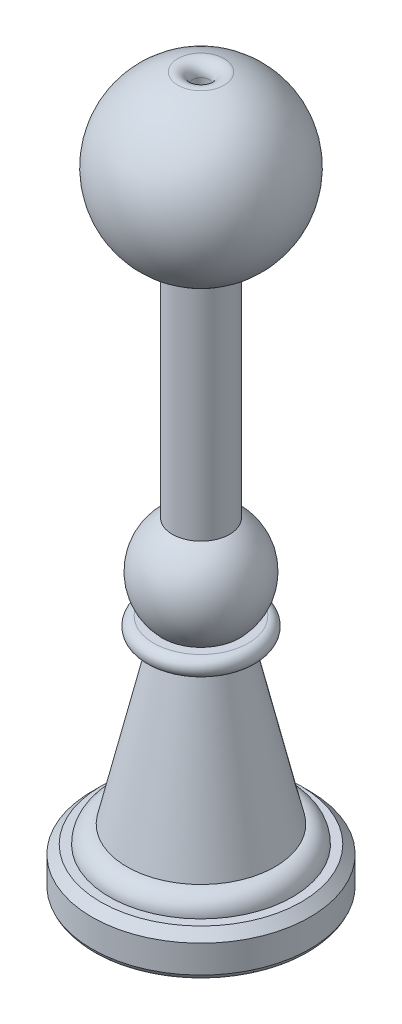
ISO-10303-21;
HEADER;
FILE_DESCRIPTION(('STEP AP214'),'2;1');
FILE_NAME('part.step','',(''),(''),'','','');
FILE_SCHEMA(('AUTOMOTIVE_DESIGN { 1 0 10303 214 1 1 1 1 }'));
ENDSEC;
DATA;
#1=APPLICATION_CONTEXT('core data for automotive mechanical design processes');
#2=APPLICATION_PROTOCOL_DEFINITION('international standard','automotive_design',2000,#1);
#3=PRODUCT_CONTEXT('',#1,'mechanical');
#4=PRODUCT('Part','Part','',(#3));
#5=PRODUCT_RELATED_PRODUCT_CATEGORY('part','',(#4));
#6=PRODUCT_DEFINITION_FORMATION('','',#4);
#7=PRODUCT_DEFINITION_CONTEXT('part definition',#1,'design');
#8=PRODUCT_DEFINITION('design','',#6,#7);
#9=PRODUCT_DEFINITION_SHAPE('','',#8);
#10=(LENGTH_UNIT() NAMED_UNIT(*) SI_UNIT(.MILLI.,.METRE.));
#11=(NAMED_UNIT(*) PLANE_ANGLE_UNIT() SI_UNIT($,.RADIAN.));
#12=(NAMED_UNIT(*) SI_UNIT($,.STERADIAN.) SOLID_ANGLE_UNIT());
#13=UNCERTAINTY_MEASURE_WITH_UNIT(LENGTH_MEASURE(1.E-05),#10,'distance_accuracy_value','');
#14=(GEOMETRIC_REPRESENTATION_CONTEXT(3) GLOBAL_UNCERTAINTY_ASSIGNED_CONTEXT((#13)) GLOBAL_UNIT_ASSIGNED_CONTEXT((#10,
#11,#12)) REPRESENTATION_CONTEXT('',''));
#15=CARTESIAN_POINT('',(0.,0.,0.));
#16=DIRECTION('',(0.,0.,1.));
#17=DIRECTION('',(1.,0.,0.));
#18=AXIS2_PLACEMENT_3D('',#15,#16,#17);
#19=CARTESIAN_POINT('',(0.,62.32,0.));
#20=DIRECTION('',(0.,-1.,0.));
#21=DIRECTION('',(1.,0.,0.));
#22=AXIS2_PLACEMENT_3D('',#19,#20,#21);
#23=CYLINDRICAL_SURFACE('',#22,0.75);
#24=CARTESIAN_POINT('',(0.,60.6510598246399,0.));
#25=DIRECTION('',(0.,-1.,0.));
#26=DIRECTION('',(1.,0.,0.));
#27=AXIS2_PLACEMENT_3D('',#24,#25,#26);
#28=CIRCLE('',#27,0.75);
#29=CARTESIAN_POINT('',(0.75,60.6510598246399,0.));
#30=VERTEX_POINT('',#29);
#31=EDGE_CURVE('E53',#30,#30,#28,.F.);
#32=ORIENTED_EDGE('',*,*,#31,.T.);
#33=EDGE_LOOP('',(#32));
#34=FACE_BOUND('',#33,.T.);
#35=CARTESIAN_POINT('',(0.,1.32,0.));
#36=DIRECTION('',(0.,-1.,0.));
#37=DIRECTION('',(1.,0.,0.));
#38=AXIS2_PLACEMENT_3D('',#35,#36,#37);
#39=CIRCLE('',#38,0.75);
#40=CARTESIAN_POINT('',(0.75,1.32,0.));
#41=VERTEX_POINT('',#40);
#42=EDGE_CURVE('E67',#41,#41,#39,.F.);
#43=ORIENTED_EDGE('',*,*,#42,.F.);
#44=EDGE_LOOP('',(#43));
#45=FACE_BOUND('',#44,.T.);
#46=ADVANCED_FACE('F45',(#34,#45),#23,.F.);
#47=CARTESIAN_POINT('',(0.,0.,0.));
#48=DIRECTION('',(0.,-1.,0.));
#49=DIRECTION('',(0.,0.,-1.));
#50=AXIS2_PLACEMENT_3D('',#47,#48,#49);
#51=CYLINDRICAL_SURFACE('',#50,9.525);
#52=CARTESIAN_POINT('',(0.,2.413,0.));
#53=DIRECTION('',(0.,-1.,0.));
#54=DIRECTION('',(0.,0.,-1.));
#55=AXIS2_PLACEMENT_3D('',#52,#53,#54);
#56=CIRCLE('',#55,9.525);
#57=CARTESIAN_POINT('',(0.,2.413,-9.525));
#58=VERTEX_POINT('',#57);
#59=EDGE_CURVE('E116',#58,#58,#56,.T.);
#60=ORIENTED_EDGE('',*,*,#59,.T.);
#61=EDGE_LOOP('',(#60));
#62=FACE_BOUND('',#61,.T.);
#63=CARTESIAN_POINT('',(0.,0.,0.));
#64=DIRECTION('',(0.,-1.,0.));
#65=DIRECTION('',(0.,0.,-1.));
#66=AXIS2_PLACEMENT_3D('',#63,#64,#65);
#67=CIRCLE('',#66,9.525);
#68=CARTESIAN_POINT('',(0.,0.,-9.525));
#69=VERTEX_POINT('',#68);
#70=EDGE_CURVE('E112',#69,#69,#67,.T.);
#71=ORIENTED_EDGE('',*,*,#70,.F.);
#72=EDGE_LOOP('',(#71));
#73=FACE_BOUND('',#72,.T.);
#74=ADVANCED_FACE('F148',(#62,#73),#51,.T.);
#75=CARTESIAN_POINT('',(-9.525,3.175,0.));
#76=DIRECTION('',(0.,-1.,0.));
#77=DIRECTION('',(0.,0.,-1.));
#78=AXIS2_PLACEMENT_3D('',#75,#76,#77);
#79=PLANE('',#78);
#80=CARTESIAN_POINT('',(0.,3.175,0.));
#81=DIRECTION('',(0.,-1.,0.));
#82=DIRECTION('',(0.,0.,-1.));
#83=AXIS2_PLACEMENT_3D('',#80,#81,#82);
#84=CIRCLE('',#83,8.763);
#85=CARTESIAN_POINT('',(0.,3.175,-8.763));
#86=VERTEX_POINT('',#85);
#87=EDGE_CURVE('E120',#86,#86,#84,.F.);
#88=ORIENTED_EDGE('',*,*,#87,.T.);
#89=EDGE_LOOP('',(#88));
#90=FACE_BOUND('',#89,.T.);
#91=CARTESIAN_POINT('',(0.,3.175,0.));
#92=DIRECTION('',(0.,-1.,0.));
#93=DIRECTION('',(0.,0.,-1.));
#94=AXIS2_PLACEMENT_3D('',#91,#92,#93);
#95=CIRCLE('',#94,8.001);
#96=CARTESIAN_POINT('',(0.,3.175,-8.001));
#97=VERTEX_POINT('',#96);
#98=EDGE_CURVE('E108',#97,#97,#95,.T.);
#99=ORIENTED_EDGE('',*,*,#98,.T.);
#100=EDGE_LOOP('',(#99));
#101=FACE_BOUND('',#100,.T.);
#102=ADVANCED_FACE('F155',(#90,#101),#79,.F.);
#103=CARTESIAN_POINT('',(0.,18.923,0.));
#104=DIRECTION('',(0.,-1.,0.));
#105=DIRECTION('',(0.,0.,-1.));
#106=AXIS2_PLACEMENT_3D('',#103,#104,#105);
#107=CONICAL_SURFACE('',#106,3.175,0.228102628279942);
#108=CARTESIAN_POINT('',(0.,4.699,0.));
#109=DIRECTION('',(0.,-1.,0.));
#110=DIRECTION('',(0.,0.,-1.));
#111=AXIS2_PLACEMENT_3D('',#108,#109,#110);
#112=CIRCLE('',#111,6.477);
#113=CARTESIAN_POINT('',(0.,4.699,-6.477));
#114=VERTEX_POINT('',#113);
#115=EDGE_CURVE('E104',#114,#114,#112,.T.);
#116=ORIENTED_EDGE('',*,*,#115,.F.);
#117=EDGE_LOOP('',(#116));
#118=FACE_BOUND('',#117,.T.);
#119=CARTESIAN_POINT('',(0.,18.923,0.));
#120=DIRECTION('',(0.,-1.,0.));
#121=DIRECTION('',(0.,0.,-1.));
#122=AXIS2_PLACEMENT_3D('',#119,#120,#121);
#123=CIRCLE('',#122,3.175);
#124=CARTESIAN_POINT('',(0.,18.923,-3.175));
#125=VERTEX_POINT('',#124);
#126=EDGE_CURVE('E100',#125,#125,#123,.T.);
#127=ORIENTED_EDGE('',*,*,#126,.T.);
#128=EDGE_LOOP('',(#127));
#129=FACE_BOUND('',#128,.T.);
#130=ADVANCED_FACE('F186',(#118,#129),#107,.T.);
#131=CARTESIAN_POINT('',(-3.175,18.923,0.));
#132=DIRECTION('',(0.,1.,0.));
#133=DIRECTION('',(0.,0.,1.));
#134=AXIS2_PLACEMENT_3D('',#131,#132,#133);
#135=PLANE('',#134);
#136=ORIENTED_EDGE('',*,*,#126,.F.);
#137=EDGE_LOOP('',(#136));
#138=FACE_BOUND('',#137,.T.);
#139=CARTESIAN_POINT('',(0.,18.923,0.));
#140=DIRECTION('',(0.,-1.,0.));
#141=DIRECTION('',(0.,0.,-1.));
#142=AXIS2_PLACEMENT_3D('',#139,#140,#141);
#143=CIRCLE('',#142,4.1316907870011);
#144=CARTESIAN_POINT('',(0.,18.923,-4.1316907870011));
#145=VERTEX_POINT('',#144);
#146=EDGE_CURVE('E96',#145,#145,#143,.T.);
#147=ORIENTED_EDGE('',*,*,#146,.T.);
#148=EDGE_LOOP('',(#147));
#149=FACE_BOUND('',#148,.T.);
#150=ADVANCED_FACE('F182',(#138,#149),#135,.F.);
#151=CARTESIAN_POINT('',(0.,19.685,0.));
#152=DIRECTION('',(0.,-1.,0.));
#153=DIRECTION('',(0.,0.,-1.));
#154=AXIS2_PLACEMENT_3D('',#151,#152,#153);
#155=TOROIDAL_SURFACE('',#154,4.1316907870011,0.762000000000001);
#156=ORIENTED_EDGE('',*,*,#146,.F.);
#157=EDGE_LOOP('',(#156));
#158=FACE_BOUND('',#157,.T.);
#159=CARTESIAN_POINT('',(0.,20.447,0.));
#160=DIRECTION('',(0.,-1.,0.));
#161=DIRECTION('',(0.,0.,-1.));
#162=AXIS2_PLACEMENT_3D('',#159,#160,#161);
#163=CIRCLE('',#162,4.1316907870011);
#164=CARTESIAN_POINT('',(0.,20.447,-4.1316907870011));
#165=VERTEX_POINT('',#164);
#166=EDGE_CURVE('E92',#165,#165,#163,.T.);
#167=ORIENTED_EDGE('',*,*,#166,.T.);
#168=EDGE_LOOP('',(#167));
#169=FACE_BOUND('',#168,.T.);
#170=ADVANCED_FACE('F178',(#158,#169),#155,.T.);
#171=CARTESIAN_POINT('',(-4.1316907870011,20.447,0.));
#172=DIRECTION('',(0.,-1.,0.));
#173=DIRECTION('',(0.,0.,-1.));
#174=AXIS2_PLACEMENT_3D('',#171,#172,#173);
#175=PLANE('',#174);
#176=ORIENTED_EDGE('',*,*,#166,.F.);
#177=EDGE_LOOP('',(#176));
#178=FACE_BOUND('',#177,.T.);
#179=CARTESIAN_POINT('',(0.,20.447,0.));
#180=DIRECTION('',(0.,-1.,0.));
#181=DIRECTION('',(0.,0.,-1.));
#182=AXIS2_PLACEMENT_3D('',#179,#180,#181);
#183=CIRCLE('',#182,3.36969078700109);
#184=CARTESIAN_POINT('',(3.36969078700108,20.447,0.));
#185=VERTEX_POINT('',#184);
#186=EDGE_CURVE('E88',#185,#185,#183,.T.);
#187=ORIENTED_EDGE('',*,*,#186,.T.);
#188=EDGE_LOOP('',(#187));
#189=FACE_BOUND('',#188,.T.);
#190=ADVANCED_FACE('F174',(#178,#189),#175,.F.);
#191=CARTESIAN_POINT('',(0.,23.8125,0.));
#192=DIRECTION('',(0.,-1.,0.));
#193=DIRECTION('',(1.,0.,0.));
#194=AXIS2_PLACEMENT_3D('',#191,#192,#193);
#195=SPHERICAL_SURFACE('',#194,4.7625);
#196=CARTESIAN_POINT('',(0.,27.8660671019486,0.));
#197=DIRECTION('',(0.,-1.,0.));
#198=DIRECTION('',(1.,0.,0.));
#199=AXIS2_PLACEMENT_3D('',#196,#197,#198);
#200=CIRCLE('',#199,2.49999999999999);
#201=CARTESIAN_POINT('',(2.49999999999998,27.8660671019486,0.));
#202=VERTEX_POINT('',#201);
#203=EDGE_CURVE('E87',#202,#202,#200,.T.);
#204=CARTESIAN_POINT('',(2.49999999999998,27.8660671019486,0.));
#205=CARTESIAN_POINT('',(2.57612991964176,27.8191180478428,0.));
#206=CARTESIAN_POINT('',(2.65093398236838,27.7700197474447,0.));
#207=CARTESIAN_POINT('',(2.79766021287122,27.6676908126363,0.));
#208=CARTESIAN_POINT('',(2.86958238064744,27.6144601782259,0.));
#209=CARTESIAN_POINT('',(3.0103146401294,27.5040327339652,0.));
#210=CARTESIAN_POINT('',(3.07912473183514,27.4468359241149,0.));
#211=CARTESIAN_POINT('',(3.21341498499322,27.3286583883182,0.));
#212=CARTESIAN_POINT('',(3.27889514644556,27.2676776623718,0.));
#213=CARTESIAN_POINT('',(3.40631759596305,27.1421256206083,0.));
#214=CARTESIAN_POINT('',(3.4682598840282,27.0775543047913,0.));
#215=CARTESIAN_POINT('',(3.58841004719139,26.9450260567064,0.));
#216=CARTESIAN_POINT('',(3.64661792228943,26.8770691244385,0.));
#217=CARTESIAN_POINT('',(3.7591145241288,26.7379852936839,0.));
#218=CARTESIAN_POINT('',(3.81340325087013,26.6668583951973,0.));
#219=CARTESIAN_POINT('',(3.91788927084033,26.5216603603875,0.));
#220=CARTESIAN_POINT('',(3.9680865640692,26.4475892240644,0.));
#221=CARTESIAN_POINT('',(4.06423041283041,26.2967377807879,0.));
#222=CARTESIAN_POINT('',(4.11017696836274,26.2199574738344,0.));
#223=CARTESIAN_POINT('',(4.19767352836957,26.0639313554837,0.));
#224=CARTESIAN_POINT('',(4.23922353284406,25.9846855440865,0.));
#225=CARTESIAN_POINT('',(4.31779512979227,25.8239799070811,0.));
#226=CARTESIAN_POINT('',(4.35481672226598,25.7425200814727,0.));
#227=CARTESIAN_POINT('',(4.42421400546305,25.577644932649,0.));
#228=CARTESIAN_POINT('',(4.45658969618641,25.4942296094335,0.));
#229=CARTESIAN_POINT('',(4.5165924301033,25.325708187838,0.));
#230=CARTESIAN_POINT('',(4.54421947329682,25.240602089458,0.));
#231=CARTESIAN_POINT('',(4.59463723643526,25.068969205737,0.));
#232=CARTESIAN_POINT('',(4.61742795638018,24.982442420396,0.));
#233=CARTESIAN_POINT('',(4.6581007456005,24.8082427595718,0.));
#234=CARTESIAN_POINT('',(4.6759828148759,24.7205698840886,0.));
#235=CARTESIAN_POINT('',(4.70678155317015,24.5443562769701,0.));
#236=CARTESIAN_POINT('',(4.719698222189,24.4558155453348,0.));
#237=CARTESIAN_POINT('',(4.74052516831405,24.2781472140843,0.));
#238=CARTESIAN_POINT('',(4.74843544542025,24.1890196144692,0.));
#239=CARTESIAN_POINT('',(4.75922450408394,24.0104603978843,0.));
#240=CARTESIAN_POINT('',(4.76210328564143,23.9210287809147,0.));
#241=CARTESIAN_POINT('',(4.76282021725905,23.7421453450597,0.));
#242=CARTESIAN_POINT('',(4.76065836731919,23.6526935261744,0.));
#243=CARTESIAN_POINT('',(4.75130089667482,23.4740535660384,0.));
#244=CARTESIAN_POINT('',(4.74410527597032,23.3848654247876,0.));
#245=CARTESIAN_POINT('',(4.72470309943581,23.2070358626789,0.));
#246=CARTESIAN_POINT('',(4.7124965436058,23.1183944418209,0.));
#247=CARTESIAN_POINT('',(4.6831112349036,22.9419396282077,0.));
#248=CARTESIAN_POINT('',(4.66593248203139,22.8541262354525,0.));
#249=CARTESIAN_POINT('',(4.62665729680629,22.679606157989,0.));
#250=CARTESIAN_POINT('',(4.60456086445339,22.5928994732807,0.));
#251=CARTESIAN_POINT('',(4.55552044440026,22.4208679795895,0.));
#252=CARTESIAN_POINT('',(4.52857645670002,22.3355431706066,0.));
#253=CARTESIAN_POINT('',(4.46992643371321,22.1665462108799,0.));
#254=CARTESIAN_POINT('',(4.43822039842665,22.082874060136,0.));
#255=CARTESIAN_POINT('',(4.37014690179311,21.9174479535569,0.));
#256=CARTESIAN_POINT('',(4.33377944044614,21.8356939977217,0.));
#257=CARTESIAN_POINT('',(4.25649850205683,21.674363734087,0.));
#258=CARTESIAN_POINT('',(4.21558502501448,21.5947874262876,0.));
#259=CARTESIAN_POINT('',(4.12934190907289,21.438064986282,0.));
#260=CARTESIAN_POINT('',(4.08401227017364,21.360918854076,0.));
#261=CARTESIAN_POINT('',(3.98908063775333,21.2093016354034,0.));
#262=CARTESIAN_POINT('',(3.93947864423227,21.1348305489368,0.));
#263=CARTESIAN_POINT('',(3.83615989784472,20.9887995977479,0.));
#264=CARTESIAN_POINT('',(3.78244314497822,20.9172397330254,0.));
#265=CARTESIAN_POINT('',(3.6710646769663,20.7772589265977,0.));
#266=CARTESIAN_POINT('',(3.61340296182087,20.7088379848924,0.));
#267=CARTESIAN_POINT('',(3.49432008268562,20.5753499123411,0.));
#268=CARTESIAN_POINT('',(3.43289891869581,20.5102827814951,0.));
#269=CARTESIAN_POINT('',(3.36969078700108,20.447,0.));
#270=B_SPLINE_CURVE_WITH_KNOTS('',3,(#204,#205,#206,#207,#208,#209,#210,#211,#212,#213,#214,
#215,#216,#217,#218,#219,#220,#221,#222,#223,#224,#225,#226,#227,#228,#229,#230,#231,#232,#233,
#234,#235,#236,#237,#238,#239,#240,#241,#242,#243,#244,#245,#246,#247,#248,#249,#250,#251,#252,
#253,#254,#255,#256,#257,#258,#259,#260,#261,#262,#263,#264,#265,#266,#267,#268,#269),
.UNSPECIFIED.,.F.,.F.,(4,2,2,2,2,2,2,2,2,2,2,2,2,2,2,2,2,2,2,2,2,2,2,2,2,2,2,2,2,2,2,2,4),(0.,
0.26829183459468,0.536583669189357,0.804875503784033,1.07316733837871,1.34145917297339,
1.60975100756807,1.87804284216274,2.14633467675742,2.4146265113521,2.68291834594677,
2.95121018054145,3.21950201513613,3.48779384973081,3.75608568432548,4.02437751892016,
4.29266935351484,4.56096118810952,4.82925302270419,5.09754485729887,5.36583669189355,
5.63412852648822,5.9024203610829,6.17071219567758,6.43900403027226,6.70729586486694,
6.97558769946161,7.24387953405629,7.51217136865097,7.78046320324565,8.04875503784032,
8.317046872435,8.58533870702968),.UNSPECIFIED.);
#271=EDGE_CURVE('BSEAM170',#202,#185,#270,.T.);
#272=ORIENTED_EDGE('',*,*,#203,.T.);
#273=ORIENTED_EDGE('',*,*,#186,.F.);
#274=ORIENTED_EDGE('',*,*,#271,.T.);
#275=ORIENTED_EDGE('',*,*,#271,.F.);
#276=EDGE_LOOP('',(#272,#274,#273,#275));
#277=FACE_BOUND('',#276,.T.);
#278=ADVANCED_FACE('F170',(#277),#195,.T.);
#279=CARTESIAN_POINT('',(0.,3.175,0.));
#280=DIRECTION('',(0.,-1.,0.));
#281=DIRECTION('',(0.,0.,-1.));
#282=AXIS2_PLACEMENT_3D('',#279,#280,#281);
#283=TOROIDAL_SURFACE('',#282,6.477,1.524);
#284=ORIENTED_EDGE('',*,*,#115,.T.);
#285=EDGE_LOOP('',(#284));
#286=FACE_BOUND('',#285,.T.);
#287=ORIENTED_EDGE('',*,*,#98,.F.);
#288=EDGE_LOOP('',(#287));
#289=FACE_BOUND('',#288,.T.);
#290=ADVANCED_FACE('F173',(#286,#289),#283,.T.);
#291=CARTESIAN_POINT('',(0.,2.413,0.));
#292=DIRECTION('',(0.,-1.,0.));
#293=DIRECTION('',(0.,0.,-1.));
#294=AXIS2_PLACEMENT_3D('',#291,#292,#293);
#295=CONICAL_SURFACE('',#294,9.525,0.785398163397451);
#296=CARTESIAN_POINT('',(0.,3.175,-8.763));
#297=CARTESIAN_POINT('',(0.,3.1670625,-8.7709375));
#298=CARTESIAN_POINT('',(0.,3.159125,-8.778875));
#299=CARTESIAN_POINT('',(0.,3.14325,-8.79475));
#300=CARTESIAN_POINT('',(0.,3.1353125,-8.8026875));
#301=CARTESIAN_POINT('',(0.,3.1194375,-8.8185625));
#302=CARTESIAN_POINT('',(0.,3.1115,-8.8265));
#303=CARTESIAN_POINT('',(0.,3.095625,-8.842375));
#304=CARTESIAN_POINT('',(0.,3.0876875,-8.8503125));
#305=CARTESIAN_POINT('',(0.,3.0718125,-8.8661875));
#306=CARTESIAN_POINT('',(0.,3.063875,-8.874125));
#307=CARTESIAN_POINT('',(0.,3.048,-8.89));
#308=CARTESIAN_POINT('',(0.,3.0400625,-8.8979375));
#309=CARTESIAN_POINT('',(0.,3.0241875,-8.9138125));
#310=CARTESIAN_POINT('',(0.,3.01625,-8.92175));
#311=CARTESIAN_POINT('',(0.,3.000375,-8.937625));
#312=CARTESIAN_POINT('',(0.,2.9924375,-8.9455625));
#313=CARTESIAN_POINT('',(0.,2.9765625,-8.9614375));
#314=CARTESIAN_POINT('',(0.,2.968625,-8.969375));
#315=CARTESIAN_POINT('',(0.,2.95275,-8.98525));
#316=CARTESIAN_POINT('',(0.,2.9448125,-8.9931875));
#317=CARTESIAN_POINT('',(0.,2.9289375,-9.0090625));
#318=CARTESIAN_POINT('',(0.,2.921,-9.017));
#319=CARTESIAN_POINT('',(0.,2.905125,-9.032875));
#320=CARTESIAN_POINT('',(0.,2.8971875,-9.0408125));
#321=CARTESIAN_POINT('',(0.,2.8813125,-9.0566875));
#322=CARTESIAN_POINT('',(0.,2.873375,-9.064625));
#323=CARTESIAN_POINT('',(0.,2.8575,-9.0805));
#324=CARTESIAN_POINT('',(0.,2.8495625,-9.0884375));
#325=CARTESIAN_POINT('',(0.,2.8336875,-9.1043125));
#326=CARTESIAN_POINT('',(0.,2.82575,-9.11225));
#327=CARTESIAN_POINT('',(0.,2.809875,-9.128125));
#328=CARTESIAN_POINT('',(0.,2.8019375,-9.1360625));
#329=CARTESIAN_POINT('',(0.,2.7860625,-9.1519375));
#330=CARTESIAN_POINT('',(0.,2.778125,-9.159875));
#331=CARTESIAN_POINT('',(0.,2.76225,-9.17575));
#332=CARTESIAN_POINT('',(0.,2.7543125,-9.1836875));
#333=CARTESIAN_POINT('',(0.,2.7384375,-9.1995625));
#334=CARTESIAN_POINT('',(0.,2.7305,-9.2075));
#335=CARTESIAN_POINT('',(0.,2.714625,-9.223375));
#336=CARTESIAN_POINT('',(0.,2.7066875,-9.2313125));
#337=CARTESIAN_POINT('',(0.,2.6908125,-9.2471875));
#338=CARTESIAN_POINT('',(0.,2.682875,-9.255125));
#339=CARTESIAN_POINT('',(0.,2.667,-9.271));
#340=CARTESIAN_POINT('',(0.,2.6590625,-9.2789375));
#341=CARTESIAN_POINT('',(0.,2.6431875,-9.2948125));
#342=CARTESIAN_POINT('',(0.,2.63525,-9.30275));
#343=CARTESIAN_POINT('',(0.,2.619375,-9.318625));
#344=CARTESIAN_POINT('',(0.,2.6114375,-9.3265625));
#345=CARTESIAN_POINT('',(0.,2.5955625,-9.3424375));
#346=CARTESIAN_POINT('',(0.,2.587625,-9.350375));
#347=CARTESIAN_POINT('',(0.,2.57175,-9.36625));
#348=CARTESIAN_POINT('',(0.,2.5638125,-9.3741875));
#349=CARTESIAN_POINT('',(0.,2.5479375,-9.3900625));
#350=CARTESIAN_POINT('',(0.,2.54,-9.398));
#351=CARTESIAN_POINT('',(0.,2.524125,-9.413875));
#352=CARTESIAN_POINT('',(0.,2.5161875,-9.4218125));
#353=CARTESIAN_POINT('',(0.,2.5003125,-9.4376875));
#354=CARTESIAN_POINT('',(0.,2.492375,-9.445625));
#355=CARTESIAN_POINT('',(0.,2.4765,-9.4615));
#356=CARTESIAN_POINT('',(0.,2.4685625,-9.4694375));
#357=CARTESIAN_POINT('',(0.,2.4526875,-9.4853125));
#358=CARTESIAN_POINT('',(0.,2.44475,-9.49325));
#359=CARTESIAN_POINT('',(0.,2.428875,-9.509125));
#360=CARTESIAN_POINT('',(0.,2.4209375,-9.5170625));
#361=CARTESIAN_POINT('',(0.,2.413,-9.525));
#362=B_SPLINE_CURVE_WITH_KNOTS('',3,(#296,#297,#298,#299,#300,#301,#302,#303,#304,#305,#306,
#307,#308,#309,#310,#311,#312,#313,#314,#315,#316,#317,#318,#319,#320,#321,#322,#323,#324,#325,
#326,#327,#328,#329,#330,#331,#332,#333,#334,#335,#336,#337,#338,#339,#340,#341,#342,#343,#344,
#345,#346,#347,#348,#349,#350,#351,#352,#353,#354,#355,#356,#357,#358,#359,#360,#361),
.UNSPECIFIED.,.F.,.F.,(4,2,2,2,2,2,2,2,2,2,2,2,2,2,2,2,2,2,2,2,2,2,2,2,2,2,2,2,2,2,2,2,4),(0.,
0.033675960454009,0.0673519209080182,0.101027881362028,0.134703841816037,0.168379802270046,
0.202055762724057,0.235731723178066,0.269407683632075,0.303083644086085,0.336759604540094,
0.370435564994103,0.404111525448113,0.437787485902122,0.471463446356132,0.505139406810141,
0.53881536726415,0.57249132771816,0.60616728817217,0.639843248626179,0.673519209080189,
0.707195169534198,0.740871129988207,0.774547090442217,0.808223050896226,0.841899011350235,
0.875574971804246,0.909250932258255,0.942926892712264,0.976602853166274,1.01027881362028,
1.04395477407429,1.0776307345283),.UNSPECIFIED.);
#363=EDGE_CURVE('BSEAM165',#86,#58,#362,.T.);
#364=ORIENTED_EDGE('',*,*,#87,.F.);
#365=ORIENTED_EDGE('',*,*,#59,.F.);
#366=ORIENTED_EDGE('',*,*,#363,.T.);
#367=ORIENTED_EDGE('',*,*,#363,.F.);
#368=EDGE_LOOP('',(#364,#366,#365,#367));
#369=FACE_BOUND('',#368,.T.);
#370=ADVANCED_FACE('F165',(#369),#295,.T.);
#371=CARTESIAN_POINT('',(0.,28.575,0.));
#372=DIRECTION('',(0.,-1.,0.));
#373=DIRECTION('',(1.,0.,0.));
#374=AXIS2_PLACEMENT_3D('',#371,#372,#373);
#375=CYLINDRICAL_SURFACE('',#374,2.49999999999999);
#376=CARTESIAN_POINT('',(0.,47.32,0.));
#377=DIRECTION('',(0.,-1.,0.));
#378=DIRECTION('',(1.,0.,0.));
#379=AXIS2_PLACEMENT_3D('',#376,#377,#378);
#380=CIRCLE('',#379,2.49999999999999);
#381=CARTESIAN_POINT('',(-2.49999999999998,47.32,0.));
#382=VERTEX_POINT('',#381);
#383=EDGE_CURVE('E77',#382,#382,#380,.T.);
#384=ORIENTED_EDGE('',*,*,#383,.T.);
#385=EDGE_LOOP('',(#384));
#386=FACE_BOUND('',#385,.T.);
#387=ORIENTED_EDGE('',*,*,#203,.F.);
#388=EDGE_LOOP('',(#387));
#389=FACE_BOUND('',#388,.T.);
#390=ADVANCED_FACE('F163',(#386,#389),#375,.T.);
#391=CARTESIAN_POINT('',(0.,54.3910678118655,0.));
#392=DIRECTION('',(0.,-1.,0.));
#393=DIRECTION('',(-1.,0.,0.));
#394=AXIS2_PLACEMENT_3D('',#391,#392,#393);
#395=SPHERICAL_SURFACE('',#394,7.5);
#396=CARTESIAN_POINT('',(0.,61.6141355189129,0.));
#397=DIRECTION('',(0.,-1.,0.));
#398=DIRECTION('',(1.,0.,0.));
#399=AXIS2_PLACEMENT_3D('',#396,#397,#398);
#400=CIRCLE('',#399,2.01923076923077);
#401=CARTESIAN_POINT('',(-2.01923076923081,61.6141355189129,0.));
#402=VERTEX_POINT('',#401);
#403=EDGE_CURVE('E58',#402,#402,#400,.T.);
#404=CARTESIAN_POINT('',(-2.01923076923081,61.6141355189129,0.));
#405=CARTESIAN_POINT('',(-2.20953160429822,61.5609544672999,0.));
#406=CARTESIAN_POINT('',(-2.39771862783337,61.5002209168937,0.));
#407=CARTESIAN_POINT('',(-2.76871658126354,61.3641001632998,0.));
#408=CARTESIAN_POINT('',(-2.95152751115856,61.2887129601122,0.));
#409=CARTESIAN_POINT('',(-3.31062480673293,61.1237362457608,0.));
#410=CARTESIAN_POINT('',(-3.48691117241226,61.0341467345971,0.));
#411=CARTESIAN_POINT('',(-3.83186059886487,60.8413299356337,0.));
#412=CARTESIAN_POINT('',(-4.00052365963816,60.7381026478341,0.));
#413=CARTESIAN_POINT('',(-4.32917292168091,60.5186534055196,0.));
#414=CARTESIAN_POINT('',(-4.48915912295038,60.4024314510046,0.));
#415=CARTESIAN_POINT('',(-4.79945593096223,60.1577188772607,0.));
#416=CARTESIAN_POINT('',(-4.94976653770461,60.0292282580319,0.));
#417=CARTESIAN_POINT('',(-5.23977365804742,59.7607804844788,0.));
#418=CARTESIAN_POINT('',(-5.37947017164784,59.6208233301546,0.));
#419=CARTESIAN_POINT('',(-5.64737692238685,59.3303163335391,0.));
#420=CARTESIAN_POINT('',(-5.77558715952542,59.1797664912478,0.));
#421=CARTESIAN_POINT('',(-6.0197208759956,58.8690140672572,0.));
#422=CARTESIAN_POINT('',(-6.13564435532719,58.7088114855578,0.));
#423=CARTESIAN_POINT('',(-6.35448079035757,58.3797538071184,0.));
#424=CARTESIAN_POINT('',(-6.45739374605636,58.2108987103784,0.));
#425=CARTESIAN_POINT('',(-6.64956659811534,57.865590245644,0.));
#426=CARTESIAN_POINT('',(-6.73882649447553,57.6891368776495,0.));
#427=CARTESIAN_POINT('',(-6.90313593506464,57.329733554538,0.));
#428=CARTESIAN_POINT('',(-6.97818547929355,57.146783599421,0.));
#429=CARTESIAN_POINT('',(-7.11360564488679,56.7755293473672,0.));
#430=CARTESIAN_POINT('',(-7.17397626625113,56.5872250504305,0.));
#431=CARTESIAN_POINT('',(-7.27966166303695,56.206437789841,0.));
#432=CARTESIAN_POINT('',(-7.32497643845845,56.0139548261882,0.));
#433=CARTESIAN_POINT('',(-7.40026722122727,55.6260119967016,0.));
#434=CARTESIAN_POINT('',(-7.43024322857459,55.4305521308678,0.));
#435=CARTESIAN_POINT('',(-7.47466932043668,55.0378758478023,0.));
#436=CARTESIAN_POINT('',(-7.48911940495144,54.8406594305706,0.));
#437=CARTESIAN_POINT('',(-7.50240343225927,54.4457013624942,0.));
#438=CARTESIAN_POINT('',(-7.50123737505235,54.2479597116495,0.));
#439=CARTESIAN_POINT('',(-7.48329639917787,53.8531857734203,0.));
#440=CARTESIAN_POINT('',(-7.4665214805103,53.6561534860359,0.));
#441=CARTESIAN_POINT('',(-7.41746751567088,53.264028442901,0.));
#442=CARTESIAN_POINT('',(-7.38518846949904,53.0689356871506,0.));
#443=CARTESIAN_POINT('',(-7.30532778339972,52.6819077660172,0.));
#444=CARTESIAN_POINT('',(-7.25774614347226,52.4899726006343,0.));
#445=CARTESIAN_POINT('',(-7.14757734512282,52.1104582046128,0.));
#446=CARTESIAN_POINT('',(-7.08499018670084,51.9228789739743,0.));
#447=CARTESIAN_POINT('',(-6.94520111337658,51.5532475955586,0.));
#448=CARTESIAN_POINT('',(-6.86799919847431,51.3711954477816,0.));
#449=CARTESIAN_POINT('',(-6.69946262114405,51.013754875116,0.));
#450=CARTESIAN_POINT('',(-6.60812795871607,50.8383664502274,0.));
#451=CARTESIAN_POINT('',(-6.41189613317144,50.4953483578764,0.));
#452=CARTESIAN_POINT('',(-6.30699897005479,50.3277186904139,0.));
#453=CARTESIAN_POINT('',(-6.08429706618916,50.0012647081312,0.));
#454=CARTESIAN_POINT('',(-5.96649232544017,49.8424403933109,0.));
#455=CARTESIAN_POINT('',(-5.71871078156699,49.534588726611,0.));
#456=CARTESIAN_POINT('',(-5.5887339784428,49.3855613747314,0.));
#457=CARTESIAN_POINT('',(-5.31741980649825,49.0982341099667,0.));
#458=CARTESIAN_POINT('',(-5.17608243767789,48.9599341970816,0.));
#459=CARTESIAN_POINT('',(-4.88292961529152,48.6949251867865,0.));
#460=CARTESIAN_POINT('',(-4.7311141617255,48.5682160893765,0.));
#461=CARTESIAN_POINT('',(-4.4179528662451,48.3271801783451,0.));
#462=CARTESIAN_POINT('',(-4.25660702433073,48.2128533647238,0.));
#463=CARTESIAN_POINT('',(-3.92539291392364,47.9972944682716,0.));
#464=CARTESIAN_POINT('',(-3.75552464543091,47.8960623854407,0.));
#465=CARTESIAN_POINT('',(-3.40832400746608,47.7073300327192,0.));
#466=CARTESIAN_POINT('',(-3.23099163799398,47.6198297628285,0.));
#467=CARTESIAN_POINT('',(-2.86997834640095,47.4590885288482,0.));
#468=CARTESIAN_POINT('',(-2.68629742428003,47.3858475647586,0.));
#469=CARTESIAN_POINT('',(-2.49999999999998,47.32,0.));
#470=B_SPLINE_CURVE_WITH_KNOTS('',3,(#404,#405,#406,#407,#408,#409,#410,#411,#412,#413,#414,
#415,#416,#417,#418,#419,#420,#421,#422,#423,#424,#425,#426,#427,#428,#429,#430,#431,#432,#433,
#434,#435,#436,#437,#438,#439,#440,#441,#442,#443,#444,#445,#446,#447,#448,#449,#450,#451,#452,
#453,#454,#455,#456,#457,#458,#459,#460,#461,#462,#463,#464,#465,#466,#467,#468,#469),
.UNSPECIFIED.,.F.,.F.,(4,2,2,2,2,2,2,2,2,2,2,2,2,2,2,2,2,2,2,2,2,2,2,2,2,2,2,2,2,2,2,2,4),(0.,
0.592617957310407,1.18523591462081,1.77785387193122,2.37047182924162,2.96308978655203,
3.55570774386244,4.14832570117284,4.74094365848325,5.33356161579366,5.92617957310406,
6.51879753041447,7.11141548772488,7.70403344503528,8.29665140234568,8.88926935965609,
9.4818873169665,10.0745052742769,10.6671232315873,11.2597411888977,11.8523591462081,
12.4449771035185,13.0375950608289,13.6302130181393,14.2228309754498,14.8154489327602,
15.4080668900706,16.000684847381,16.5933028046914,17.1859207620018,17.7785387193122,
18.3711566766226,18.963774633933),.UNSPECIFIED.);
#471=EDGE_CURVE('BSEAM144',#402,#382,#470,.T.);
#472=ORIENTED_EDGE('',*,*,#403,.T.);
#473=ORIENTED_EDGE('',*,*,#383,.F.);
#474=ORIENTED_EDGE('',*,*,#471,.T.);
#475=ORIENTED_EDGE('',*,*,#471,.F.);
#476=EDGE_LOOP('',(#472,#474,#473,#475));
#477=FACE_BOUND('',#476,.T.);
#478=ADVANCED_FACE('F144',(#477),#395,.T.);
#479=CARTESIAN_POINT('',(0.,0.,0.));
#480=DIRECTION('',(0.,1.,0.));
#481=DIRECTION('',(-1.,0.,0.));
#482=AXIS2_PLACEMENT_3D('',#479,#480,#481);
#483=CONICAL_SURFACE('',#482,10.,1.04608569775846);
#484=CARTESIAN_POINT('',(0.,-0.530331233142379,0.));
#485=DIRECTION('',(0.,-1.,0.));
#486=DIRECTION('',(1.,0.,0.));
#487=AXIS2_PLACEMENT_3D('',#484,#485,#486);
#488=CIRCLE('',#487,9.08379342931);
#489=CARTESIAN_POINT('',(9.08379342930999,-0.530331233142379,0.));
#490=VERTEX_POINT('',#489);
#491=EDGE_CURVE('E64',#490,#490,#488,.T.);
#492=ORIENTED_EDGE('',*,*,#491,.T.);
#493=EDGE_LOOP('',(#492));
#494=FACE_BOUND('',#493,.T.);
#495=CARTESIAN_POINT('',(0.,-2.68,0.));
#496=DIRECTION('',(0.,-1.,0.));
#497=DIRECTION('',(1.,0.,0.));
#498=AXIS2_PLACEMENT_3D('',#495,#496,#497);
#499=CIRCLE('',#498,5.36999999999999);
#500=CARTESIAN_POINT('',(5.36999999999999,-2.68,0.));
#501=VERTEX_POINT('',#500);
#502=EDGE_CURVE('E70',#501,#501,#499,.T.);
#503=ORIENTED_EDGE('',*,*,#502,.F.);
#504=EDGE_LOOP('',(#503));
#505=FACE_BOUND('',#504,.T.);
#506=ADVANCED_FACE('F130',(#494,#505),#483,.T.);
#507=CARTESIAN_POINT('',(0.,0.335137708739463,0.));
#508=DIRECTION('',(0.,1.,0.));
#509=DIRECTION('',(-1.,0.,0.));
#510=AXIS2_PLACEMENT_3D('',#507,#508,#509);
#511=TOROIDAL_SURFACE('',#510,8.58283084524016,1.);
#512=ORIENTED_EDGE('',*,*,#70,.T.);
#513=EDGE_LOOP('',(#512));
#514=FACE_BOUND('',#513,.T.);
#515=ORIENTED_EDGE('',*,*,#491,.F.);
#516=EDGE_LOOP('',(#515));
#517=FACE_BOUND('',#516,.T.);
#518=ADVANCED_FACE('F133',(#514,#517),#511,.T.);
#519=CARTESIAN_POINT('',(0.,60.6510598246399,0.));
#520=DIRECTION('',(0.,-1.,0.));
#521=DIRECTION('',(1.,0.,0.));
#522=AXIS2_PLACEMENT_3D('',#519,#520,#521);
#523=TOROIDAL_SURFACE('',#522,1.75,1.);
#524=ORIENTED_EDGE('',*,*,#31,.F.);
#525=EDGE_LOOP('',(#524));
#526=FACE_BOUND('',#525,.T.);
#527=ORIENTED_EDGE('',*,*,#403,.F.);
#528=EDGE_LOOP('',(#527));
#529=FACE_BOUND('',#528,.T.);
#530=ADVANCED_FACE('F135',(#526,#529),#523,.T.);
#531=CARTESIAN_POINT('',(0.,1.32,0.));
#532=DIRECTION('',(0.,-1.,0.));
#533=DIRECTION('',(1.,0.,0.));
#534=AXIS2_PLACEMENT_3D('',#531,#532,#533);
#535=PLANE('',#534);
#536=CARTESIAN_POINT('',(0.,1.32,0.));
#537=DIRECTION('',(0.,-1.,0.));
#538=DIRECTION('',(1.,0.,0.));
#539=AXIS2_PLACEMENT_3D('',#536,#537,#538);
#540=CIRCLE('',#539,5.1);
#541=CARTESIAN_POINT('',(5.1,1.32,0.));
#542=VERTEX_POINT('',#541);
#543=EDGE_CURVE('E71',#542,#542,#540,.T.);
#544=ORIENTED_EDGE('',*,*,#543,.T.);
#545=EDGE_LOOP('',(#544));
#546=FACE_BOUND('',#545,.T.);
#547=ORIENTED_EDGE('',*,*,#42,.T.);
#548=EDGE_LOOP('',(#547));
#549=FACE_BOUND('',#548,.T.);
#550=ADVANCED_FACE('F142',(#546,#549),#535,.T.);
#551=CARTESIAN_POINT('',(0.,1.32,0.));
#552=DIRECTION('',(0.,-1.,0.));
#553=DIRECTION('',(1.,0.,0.));
#554=AXIS2_PLACEMENT_3D('',#551,#552,#553);
#555=CYLINDRICAL_SURFACE('',#554,5.1);
#556=CARTESIAN_POINT('',(0.,-1.99655285500633,0.));
#557=DIRECTION('',(0.,-1.,0.));
#558=DIRECTION('',(1.,0.,0.));
#559=AXIS2_PLACEMENT_3D('',#556,#557,#558);
#560=CIRCLE('',#559,5.1);
#561=CARTESIAN_POINT('',(5.1,-1.99655285500633,0.));
#562=VERTEX_POINT('',#561);
#563=EDGE_CURVE('E10',#562,#562,#560,.T.);
#564=ORIENTED_EDGE('',*,*,#563,.T.);
#565=EDGE_LOOP('',(#564));
#566=FACE_BOUND('',#565,.T.);
#567=ORIENTED_EDGE('',*,*,#543,.F.);
#568=EDGE_LOOP('',(#567));
#569=FACE_BOUND('',#568,.T.);
#570=ADVANCED_FACE('F160',(#566,#569),#555,.F.);
#571=CARTESIAN_POINT('',(0.,-1.99655285500633,0.));
#572=DIRECTION('',(0.,-1.,0.));
#573=DIRECTION('',(1.,0.,0.));
#574=AXIS2_PLACEMENT_3D('',#571,#572,#573);
#575=TOROIDAL_SURFACE('',#574,6.1,1.);
#576=ORIENTED_EDGE('',*,*,#502,.T.);
#577=EDGE_LOOP('',(#576));
#578=FACE_BOUND('',#577,.T.);
#579=ORIENTED_EDGE('',*,*,#563,.F.);
#580=EDGE_LOOP('',(#579));
#581=FACE_BOUND('',#580,.T.);
#582=ADVANCED_FACE('F47',(#578,#581),#575,.T.);
#583=CLOSED_SHELL('',(#46,#74,#102,#130,#150,#170,#190,#278,#290,#370,#390,#478,#506,#518,#530,
#550,#570,#582));
#584=MANIFOLD_SOLID_BREP('B2',#583);
#585=ADVANCED_BREP_SHAPE_REPRESENTATION('',(#18,#584),#14);
#586=SHAPE_DEFINITION_REPRESENTATION(#9,#585);
ENDSEC;
END-ISO-10303-21;
